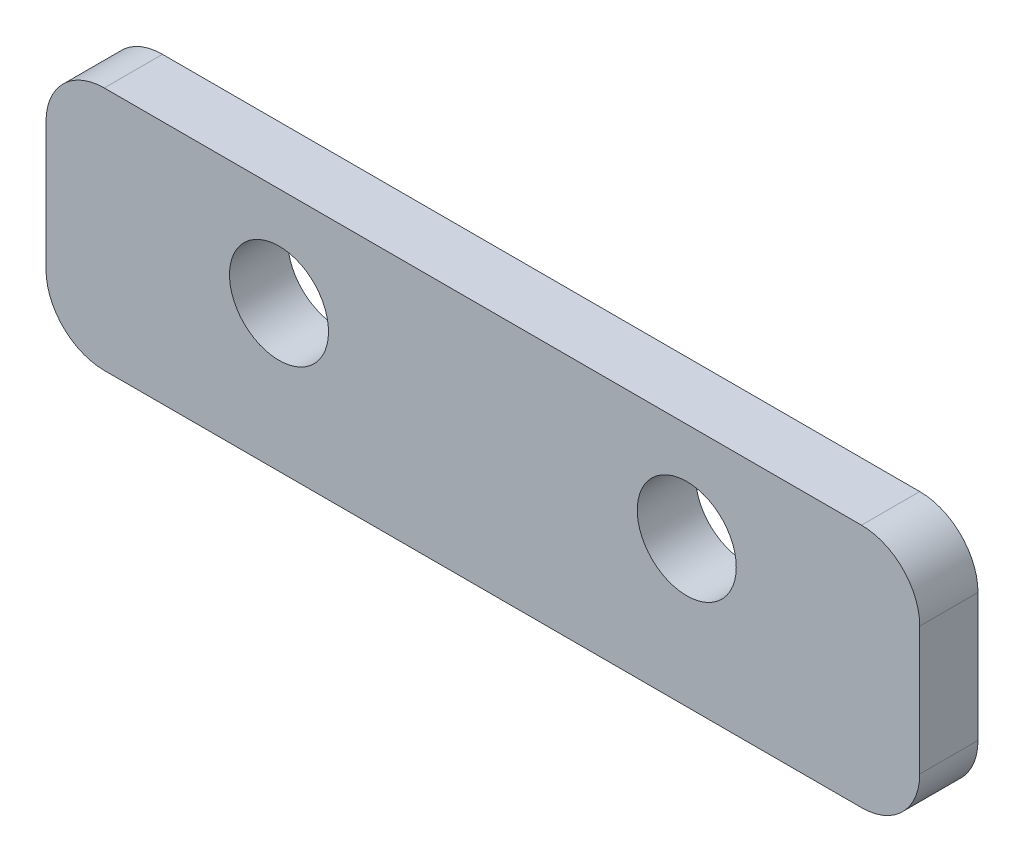
ISO-10303-21;
HEADER;
FILE_DESCRIPTION(('STEP AP214'),'2;1');
FILE_NAME('part.step','',(''),(''),'','','');
FILE_SCHEMA(('AUTOMOTIVE_DESIGN { 1 0 10303 214 1 1 1 1 }'));
ENDSEC;
DATA;
#1=APPLICATION_CONTEXT('core data for automotive mechanical design processes');
#2=APPLICATION_PROTOCOL_DEFINITION('international standard','automotive_design',2000,#1);
#3=PRODUCT_CONTEXT('',#1,'mechanical');
#4=PRODUCT('Part','Part','',(#3));
#5=PRODUCT_RELATED_PRODUCT_CATEGORY('part','',(#4));
#6=PRODUCT_DEFINITION_FORMATION('','',#4);
#7=PRODUCT_DEFINITION_CONTEXT('part definition',#1,'design');
#8=PRODUCT_DEFINITION('design','',#6,#7);
#9=PRODUCT_DEFINITION_SHAPE('','',#8);
#10=(LENGTH_UNIT() NAMED_UNIT(*) SI_UNIT(.MILLI.,.METRE.));
#11=(NAMED_UNIT(*) PLANE_ANGLE_UNIT() SI_UNIT($,.RADIAN.));
#12=(NAMED_UNIT(*) SI_UNIT($,.STERADIAN.) SOLID_ANGLE_UNIT());
#13=UNCERTAINTY_MEASURE_WITH_UNIT(LENGTH_MEASURE(1.E-05),#10,'distance_accuracy_value','');
#14=(GEOMETRIC_REPRESENTATION_CONTEXT(3) GLOBAL_UNCERTAINTY_ASSIGNED_CONTEXT((#13)) GLOBAL_UNIT_ASSIGNED_CONTEXT((#10,
#11,#12)) REPRESENTATION_CONTEXT('',''));
#15=CARTESIAN_POINT('',(0.,0.,0.));
#16=DIRECTION('',(0.,0.,1.));
#17=DIRECTION('',(1.,0.,0.));
#18=AXIS2_PLACEMENT_3D('',#15,#16,#17);
#19=CARTESIAN_POINT('',(15.,-5.,2.));
#20=DIRECTION('',(-1.,0.,0.));
#21=DIRECTION('',(0.,0.,1.));
#22=AXIS2_PLACEMENT_3D('',#19,#20,#21);
#23=PLANE('',#22);
#24=DIRECTION('',(0.,1.,0.));
#25=VECTOR('',#24,1.);
#26=CARTESIAN_POINT('',(15.,-5.,2.));
#27=LINE('',#26,#25);
#28=CARTESIAN_POINT('',(15.,-3.,2.));
#29=VERTEX_POINT('',#28);
#30=CARTESIAN_POINT('',(15.,1.4,2.));
#31=VERTEX_POINT('',#30);
#32=EDGE_CURVE('E120',#29,#31,#27,.T.);
#33=ORIENTED_EDGE('',*,*,#32,.F.);
#34=DIRECTION('',(0.,0.,-1.));
#35=VECTOR('',#34,1.);
#36=CARTESIAN_POINT('',(15.,-3.,2.));
#37=LINE('',#36,#35);
#38=CARTESIAN_POINT('',(15.,-3.,0.));
#39=VERTEX_POINT('',#38);
#40=EDGE_CURVE('E105',#29,#39,#37,.T.);
#41=ORIENTED_EDGE('',*,*,#40,.T.);
#42=DIRECTION('',(0.,1.,0.));
#43=VECTOR('',#42,1.);
#44=CARTESIAN_POINT('',(15.,-5.,0.));
#45=LINE('',#44,#43);
#46=CARTESIAN_POINT('',(15.,1.4,0.));
#47=VERTEX_POINT('',#46);
#48=EDGE_CURVE('E117',#39,#47,#45,.T.);
#49=ORIENTED_EDGE('',*,*,#48,.T.);
#50=DIRECTION('',(0.,0.,-1.));
#51=VECTOR('',#50,1.);
#52=CARTESIAN_POINT('',(15.,1.4,2.));
#53=LINE('',#52,#51);
#54=EDGE_CURVE('E122',#47,#31,#53,.F.);
#55=ORIENTED_EDGE('',*,*,#54,.T.);
#56=EDGE_LOOP('',(#33,#41,#49,#55));
#57=FACE_BOUND('',#56,.T.);
#58=ADVANCED_FACE('F35',(#57),#23,.F.);
#59=CARTESIAN_POINT('',(-15.,-5.,2.));
#60=DIRECTION('',(1.,0.,0.));
#61=DIRECTION('',(0.,0.,-1.));
#62=AXIS2_PLACEMENT_3D('',#59,#60,#61);
#63=PLANE('',#62);
#64=DIRECTION('',(0.,-1.,0.));
#65=VECTOR('',#64,1.);
#66=CARTESIAN_POINT('',(-15.,-5.,0.));
#67=LINE('',#66,#65);
#68=CARTESIAN_POINT('',(-15.,1.4,0.));
#69=VERTEX_POINT('',#68);
#70=CARTESIAN_POINT('',(-15.,-3.,0.));
#71=VERTEX_POINT('',#70);
#72=EDGE_CURVE('E127',#69,#71,#67,.T.);
#73=ORIENTED_EDGE('',*,*,#72,.T.);
#74=DIRECTION('',(0.,0.,-1.));
#75=VECTOR('',#74,1.);
#76=CARTESIAN_POINT('',(-15.,-3.,2.));
#77=LINE('',#76,#75);
#78=CARTESIAN_POINT('',(-15.,-3.,2.));
#79=VERTEX_POINT('',#78);
#80=EDGE_CURVE('E50',#71,#79,#77,.F.);
#81=ORIENTED_EDGE('',*,*,#80,.T.);
#82=DIRECTION('',(0.,-1.,0.));
#83=VECTOR('',#82,1.);
#84=CARTESIAN_POINT('',(-15.,-5.,2.));
#85=LINE('',#84,#83);
#86=CARTESIAN_POINT('',(-15.,1.4,2.));
#87=VERTEX_POINT('',#86);
#88=EDGE_CURVE('E181',#87,#79,#85,.T.);
#89=ORIENTED_EDGE('',*,*,#88,.F.);
#90=DIRECTION('',(0.,0.,1.));
#91=VECTOR('',#90,1.);
#92=CARTESIAN_POINT('',(-15.,1.4,2.));
#93=LINE('',#92,#91);
#94=EDGE_CURVE('E155',#87,#69,#93,.F.);
#95=ORIENTED_EDGE('',*,*,#94,.T.);
#96=EDGE_LOOP('',(#73,#81,#89,#95));
#97=FACE_BOUND('',#96,.T.);
#98=ADVANCED_FACE('F191',(#97),#63,.F.);
#99=CARTESIAN_POINT('',(-15.,-5.,2.));
#100=DIRECTION('',(0.,1.,0.));
#101=DIRECTION('',(0.,0.,1.));
#102=AXIS2_PLACEMENT_3D('',#99,#100,#101);
#103=PLANE('',#102);
#104=DIRECTION('',(1.,0.,0.));
#105=VECTOR('',#104,1.);
#106=CARTESIAN_POINT('',(-15.,-5.,0.));
#107=LINE('',#106,#105);
#108=CARTESIAN_POINT('',(-13.,-5.,0.));
#109=VERTEX_POINT('',#108);
#110=CARTESIAN_POINT('',(13.,-5.,0.));
#111=VERTEX_POINT('',#110);
#112=EDGE_CURVE('E130',#109,#111,#107,.T.);
#113=ORIENTED_EDGE('',*,*,#112,.T.);
#114=DIRECTION('',(0.,0.,-1.));
#115=VECTOR('',#114,1.);
#116=CARTESIAN_POINT('',(13.,-5.,2.));
#117=LINE('',#116,#115);
#118=CARTESIAN_POINT('',(13.,-5.,2.));
#119=VERTEX_POINT('',#118);
#120=EDGE_CURVE('E106',#111,#119,#117,.F.);
#121=ORIENTED_EDGE('',*,*,#120,.T.);
#122=DIRECTION('',(1.,0.,0.));
#123=VECTOR('',#122,1.);
#124=CARTESIAN_POINT('',(-15.,-5.,2.));
#125=LINE('',#124,#123);
#126=CARTESIAN_POINT('',(-13.,-5.,2.));
#127=VERTEX_POINT('',#126);
#128=EDGE_CURVE('E136',#127,#119,#125,.T.);
#129=ORIENTED_EDGE('',*,*,#128,.F.);
#130=DIRECTION('',(0.,0.,-1.));
#131=VECTOR('',#130,1.);
#132=CARTESIAN_POINT('',(-13.,-5.,2.));
#133=LINE('',#132,#131);
#134=EDGE_CURVE('E111',#127,#109,#133,.T.);
#135=ORIENTED_EDGE('',*,*,#134,.T.);
#136=EDGE_LOOP('',(#113,#121,#129,#135));
#137=FACE_BOUND('',#136,.T.);
#138=ADVANCED_FACE('F188',(#137),#103,.F.);
#139=CARTESIAN_POINT('',(0.,0.,2.));
#140=DIRECTION('',(0.,0.,-1.));
#141=DIRECTION('',(-1.,0.,0.));
#142=AXIS2_PLACEMENT_3D('',#139,#140,#141);
#143=PLANE('',#142);
#144=CARTESIAN_POINT('',(-7.,0.,2.));
#145=DIRECTION('',(0.,0.,1.));
#146=DIRECTION('',(1.,0.,0.));
#147=AXIS2_PLACEMENT_3D('',#144,#145,#146);
#148=CIRCLE('',#147,1.7);
#149=CARTESIAN_POINT('',(-5.3,0.,2.));
#150=VERTEX_POINT('',#149);
#151=EDGE_CURVE('E171',#150,#150,#148,.T.);
#152=ORIENTED_EDGE('',*,*,#151,.F.);
#153=EDGE_LOOP('',(#152));
#154=FACE_BOUND('',#153,.T.);
#155=CARTESIAN_POINT('',(7.,0.,2.));
#156=DIRECTION('',(0.,0.,1.));
#157=DIRECTION('',(1.,0.,0.));
#158=AXIS2_PLACEMENT_3D('',#155,#156,#157);
#159=CIRCLE('',#158,1.7);
#160=CARTESIAN_POINT('',(8.7,0.,2.));
#161=VERTEX_POINT('',#160);
#162=EDGE_CURVE('E133',#161,#161,#159,.T.);
#163=ORIENTED_EDGE('',*,*,#162,.F.);
#164=EDGE_LOOP('',(#163));
#165=FACE_BOUND('',#164,.T.);
#166=ORIENTED_EDGE('',*,*,#128,.T.);
#167=CARTESIAN_POINT('',(13.,-3.,2.));
#168=DIRECTION('',(0.,0.,-1.));
#169=DIRECTION('',(-1.,0.,0.));
#170=AXIS2_PLACEMENT_3D('',#167,#168,#169);
#171=CIRCLE('',#170,2.);
#172=EDGE_CURVE('E153',#119,#29,#171,.F.);
#173=ORIENTED_EDGE('',*,*,#172,.T.);
#174=ORIENTED_EDGE('',*,*,#32,.T.);
#175=CARTESIAN_POINT('',(13.,1.4,2.));
#176=DIRECTION('',(0.,0.,-1.));
#177=DIRECTION('',(-1.,0.,0.));
#178=AXIS2_PLACEMENT_3D('',#175,#176,#177);
#179=CIRCLE('',#178,2.);
#180=CARTESIAN_POINT('',(13.,3.4,2.));
#181=VERTEX_POINT('',#180);
#182=EDGE_CURVE('E148',#31,#181,#179,.F.);
#183=ORIENTED_EDGE('',*,*,#182,.T.);
#184=DIRECTION('',(1.,0.,0.));
#185=VECTOR('',#184,1.);
#186=CARTESIAN_POINT('',(15.,3.4,2.));
#187=LINE('',#186,#185);
#188=CARTESIAN_POINT('',(-13.,3.4,2.));
#189=VERTEX_POINT('',#188);
#190=EDGE_CURVE('E165',#189,#181,#187,.T.);
#191=ORIENTED_EDGE('',*,*,#190,.F.);
#192=CARTESIAN_POINT('',(-13.,1.4,2.));
#193=DIRECTION('',(0.,0.,-1.));
#194=DIRECTION('',(-1.,0.,0.));
#195=AXIS2_PLACEMENT_3D('',#192,#193,#194);
#196=CIRCLE('',#195,2.);
#197=EDGE_CURVE('E57',#189,#87,#196,.F.);
#198=ORIENTED_EDGE('',*,*,#197,.T.);
#199=ORIENTED_EDGE('',*,*,#88,.T.);
#200=CARTESIAN_POINT('',(-13.,-3.,2.));
#201=DIRECTION('',(0.,0.,-1.));
#202=DIRECTION('',(-1.,0.,0.));
#203=AXIS2_PLACEMENT_3D('',#200,#201,#202);
#204=CIRCLE('',#203,2.);
#205=EDGE_CURVE('E151',#79,#127,#204,.F.);
#206=ORIENTED_EDGE('',*,*,#205,.T.);
#207=EDGE_LOOP('',(#166,#173,#174,#183,#191,#198,#199,#206));
#208=FACE_BOUND('',#207,.T.);
#209=ADVANCED_FACE('F185',(#154,#165,#208),#143,.F.);
#210=CARTESIAN_POINT('',(0.,0.,0.));
#211=DIRECTION('',(0.,0.,-1.));
#212=DIRECTION('',(-1.,0.,0.));
#213=AXIS2_PLACEMENT_3D('',#210,#211,#212);
#214=PLANE('',#213);
#215=ORIENTED_EDGE('',*,*,#48,.F.);
#216=CARTESIAN_POINT('',(13.,-3.,0.));
#217=DIRECTION('',(0.,0.,-1.));
#218=DIRECTION('',(-1.,0.,0.));
#219=AXIS2_PLACEMENT_3D('',#216,#217,#218);
#220=CIRCLE('',#219,2.);
#221=EDGE_CURVE('E101',#39,#111,#220,.T.);
#222=ORIENTED_EDGE('',*,*,#221,.T.);
#223=ORIENTED_EDGE('',*,*,#112,.F.);
#224=CARTESIAN_POINT('',(-13.,-3.,0.));
#225=DIRECTION('',(0.,0.,-1.));
#226=DIRECTION('',(-1.,0.,0.));
#227=AXIS2_PLACEMENT_3D('',#224,#225,#226);
#228=CIRCLE('',#227,2.);
#229=EDGE_CURVE('E112',#109,#71,#228,.T.);
#230=ORIENTED_EDGE('',*,*,#229,.T.);
#231=ORIENTED_EDGE('',*,*,#72,.F.);
#232=CARTESIAN_POINT('',(-13.,1.4,0.));
#233=DIRECTION('',(0.,0.,-1.));
#234=DIRECTION('',(-1.,0.,0.));
#235=AXIS2_PLACEMENT_3D('',#232,#233,#234);
#236=CIRCLE('',#235,2.);
#237=CARTESIAN_POINT('',(-13.,3.4,0.));
#238=VERTEX_POINT('',#237);
#239=EDGE_CURVE('E142',#69,#238,#236,.T.);
#240=ORIENTED_EDGE('',*,*,#239,.T.);
#241=DIRECTION('',(-1.,0.,0.));
#242=VECTOR('',#241,1.);
#243=CARTESIAN_POINT('',(15.,3.4,0.));
#244=LINE('',#243,#242);
#245=CARTESIAN_POINT('',(13.,3.4,0.));
#246=VERTEX_POINT('',#245);
#247=EDGE_CURVE('E163',#246,#238,#244,.T.);
#248=ORIENTED_EDGE('',*,*,#247,.F.);
#249=CARTESIAN_POINT('',(13.,1.4,0.));
#250=DIRECTION('',(0.,0.,-1.));
#251=DIRECTION('',(-1.,0.,0.));
#252=AXIS2_PLACEMENT_3D('',#249,#250,#251);
#253=CIRCLE('',#252,2.);
#254=EDGE_CURVE('E121',#246,#47,#253,.T.);
#255=ORIENTED_EDGE('',*,*,#254,.T.);
#256=EDGE_LOOP('',(#215,#222,#223,#230,#231,#240,#248,#255));
#257=FACE_BOUND('',#256,.T.);
#258=CARTESIAN_POINT('',(-7.,0.,0.));
#259=DIRECTION('',(0.,0.,1.));
#260=DIRECTION('',(1.,0.,0.));
#261=AXIS2_PLACEMENT_3D('',#258,#259,#260);
#262=CIRCLE('',#261,1.7);
#263=CARTESIAN_POINT('',(-5.3,0.,0.));
#264=VERTEX_POINT('',#263);
#265=EDGE_CURVE('E176',#264,#264,#262,.T.);
#266=ORIENTED_EDGE('',*,*,#265,.T.);
#267=EDGE_LOOP('',(#266));
#268=FACE_BOUND('',#267,.T.);
#269=CARTESIAN_POINT('',(7.,0.,0.));
#270=DIRECTION('',(0.,0.,1.));
#271=DIRECTION('',(1.,0.,0.));
#272=AXIS2_PLACEMENT_3D('',#269,#270,#271);
#273=CIRCLE('',#272,1.7);
#274=CARTESIAN_POINT('',(8.7,0.,0.));
#275=VERTEX_POINT('',#274);
#276=EDGE_CURVE('E128',#275,#275,#273,.T.);
#277=ORIENTED_EDGE('',*,*,#276,.T.);
#278=EDGE_LOOP('',(#277));
#279=FACE_BOUND('',#278,.T.);
#280=ADVANCED_FACE('F124',(#257,#268,#279),#214,.T.);
#281=CARTESIAN_POINT('',(7.,0.,2.));
#282=DIRECTION('',(0.,0.,1.));
#283=DIRECTION('',(1.,0.,0.));
#284=AXIS2_PLACEMENT_3D('',#281,#282,#283);
#285=CYLINDRICAL_SURFACE('',#284,1.7);
#286=ORIENTED_EDGE('',*,*,#276,.F.);
#287=EDGE_LOOP('',(#286));
#288=FACE_BOUND('',#287,.T.);
#289=ORIENTED_EDGE('',*,*,#162,.T.);
#290=EDGE_LOOP('',(#289));
#291=FACE_BOUND('',#290,.T.);
#292=ADVANCED_FACE('F247',(#288,#291),#285,.F.);
#293=CARTESIAN_POINT('',(-7.,0.,2.));
#294=DIRECTION('',(0.,0.,1.));
#295=DIRECTION('',(1.,0.,0.));
#296=AXIS2_PLACEMENT_3D('',#293,#294,#295);
#297=CYLINDRICAL_SURFACE('',#296,1.7);
#298=ORIENTED_EDGE('',*,*,#265,.F.);
#299=EDGE_LOOP('',(#298));
#300=FACE_BOUND('',#299,.T.);
#301=ORIENTED_EDGE('',*,*,#151,.T.);
#302=EDGE_LOOP('',(#301));
#303=FACE_BOUND('',#302,.T.);
#304=ADVANCED_FACE('F238',(#300,#303),#297,.F.);
#305=CARTESIAN_POINT('',(0.,3.4,0.));
#306=DIRECTION('',(0.,-1.,0.));
#307=DIRECTION('',(0.,0.,-1.));
#308=AXIS2_PLACEMENT_3D('',#305,#306,#307);
#309=PLANE('',#308);
#310=ORIENTED_EDGE('',*,*,#247,.T.);
#311=DIRECTION('',(0.,0.,1.));
#312=VECTOR('',#311,1.);
#313=CARTESIAN_POINT('',(-13.,3.4,0.));
#314=LINE('',#313,#312);
#315=EDGE_CURVE('E11',#238,#189,#314,.T.);
#316=ORIENTED_EDGE('',*,*,#315,.T.);
#317=ORIENTED_EDGE('',*,*,#190,.T.);
#318=DIRECTION('',(0.,0.,-1.));
#319=VECTOR('',#318,1.);
#320=CARTESIAN_POINT('',(13.,3.4,0.));
#321=LINE('',#320,#319);
#322=EDGE_CURVE('E43',#181,#246,#321,.T.);
#323=ORIENTED_EDGE('',*,*,#322,.T.);
#324=EDGE_LOOP('',(#310,#316,#317,#323));
#325=FACE_BOUND('',#324,.T.);
#326=ADVANCED_FACE('F162',(#325),#309,.F.);
#327=CARTESIAN_POINT('',(13.,-3.,2.));
#328=DIRECTION('',(0.,0.,-1.));
#329=DIRECTION('',(-1.,0.,0.));
#330=AXIS2_PLACEMENT_3D('',#327,#328,#329);
#331=CYLINDRICAL_SURFACE('',#330,2.);
#332=ORIENTED_EDGE('',*,*,#172,.F.);
#333=ORIENTED_EDGE('',*,*,#120,.F.);
#334=ORIENTED_EDGE('',*,*,#221,.F.);
#335=ORIENTED_EDGE('',*,*,#40,.F.);
#336=EDGE_LOOP('',(#332,#333,#334,#335));
#337=FACE_BOUND('',#336,.T.);
#338=ADVANCED_FACE('F104',(#337),#331,.T.);
#339=CARTESIAN_POINT('',(-13.,-3.,2.));
#340=DIRECTION('',(0.,0.,-1.));
#341=DIRECTION('',(-1.,0.,0.));
#342=AXIS2_PLACEMENT_3D('',#339,#340,#341);
#343=CYLINDRICAL_SURFACE('',#342,2.);
#344=ORIENTED_EDGE('',*,*,#205,.F.);
#345=ORIENTED_EDGE('',*,*,#80,.F.);
#346=ORIENTED_EDGE('',*,*,#229,.F.);
#347=ORIENTED_EDGE('',*,*,#134,.F.);
#348=EDGE_LOOP('',(#344,#345,#346,#347));
#349=FACE_BOUND('',#348,.T.);
#350=ADVANCED_FACE('F190',(#349),#343,.T.);
#351=CARTESIAN_POINT('',(-13.,1.4,0.));
#352=DIRECTION('',(0.,0.,1.));
#353=DIRECTION('',(1.,0.,0.));
#354=AXIS2_PLACEMENT_3D('',#351,#352,#353);
#355=CYLINDRICAL_SURFACE('',#354,2.);
#356=ORIENTED_EDGE('',*,*,#239,.F.);
#357=ORIENTED_EDGE('',*,*,#94,.F.);
#358=ORIENTED_EDGE('',*,*,#197,.F.);
#359=ORIENTED_EDGE('',*,*,#315,.F.);
#360=EDGE_LOOP('',(#356,#357,#358,#359));
#361=FACE_BOUND('',#360,.T.);
#362=ADVANCED_FACE('F194',(#361),#355,.T.);
#363=CARTESIAN_POINT('',(13.,1.4,0.));
#364=DIRECTION('',(0.,0.,-1.));
#365=DIRECTION('',(-1.,0.,0.));
#366=AXIS2_PLACEMENT_3D('',#363,#364,#365);
#367=CYLINDRICAL_SURFACE('',#366,2.);
#368=ORIENTED_EDGE('',*,*,#182,.F.);
#369=ORIENTED_EDGE('',*,*,#54,.F.);
#370=ORIENTED_EDGE('',*,*,#254,.F.);
#371=ORIENTED_EDGE('',*,*,#322,.F.);
#372=EDGE_LOOP('',(#368,#369,#370,#371));
#373=FACE_BOUND('',#372,.T.);
#374=ADVANCED_FACE('F37',(#373),#367,.T.);
#375=CLOSED_SHELL('',(#58,#98,#138,#209,#280,#292,#304,#326,#338,#350,#362,#374));
#376=MANIFOLD_SOLID_BREP('B2',#375);
#377=ADVANCED_BREP_SHAPE_REPRESENTATION('',(#18,#376),#14);
#378=SHAPE_DEFINITION_REPRESENTATION(#9,#377);
ENDSEC;
END-ISO-10303-21;
